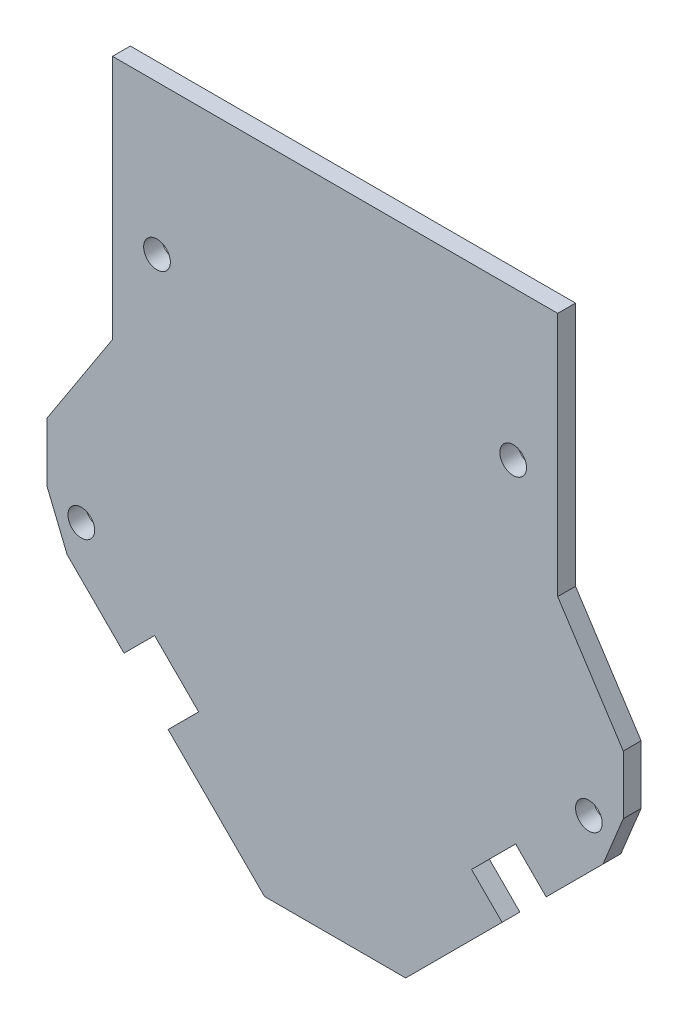
ISO-10303-21;
HEADER;
FILE_DESCRIPTION(('STEP AP214'),'2;1');
FILE_NAME('part.step','',(''),(''),'','','');
FILE_SCHEMA(('AUTOMOTIVE_DESIGN { 1 0 10303 214 1 1 1 1 }'));
ENDSEC;
DATA;
#1=APPLICATION_CONTEXT('core data for automotive mechanical design processes');
#2=APPLICATION_PROTOCOL_DEFINITION('international standard','automotive_design',2000,#1);
#3=PRODUCT_CONTEXT('',#1,'mechanical');
#4=PRODUCT('Part','Part','',(#3));
#5=PRODUCT_RELATED_PRODUCT_CATEGORY('part','',(#4));
#6=PRODUCT_DEFINITION_FORMATION('','',#4);
#7=PRODUCT_DEFINITION_CONTEXT('part definition',#1,'design');
#8=PRODUCT_DEFINITION('design','',#6,#7);
#9=PRODUCT_DEFINITION_SHAPE('','',#8);
#10=(LENGTH_UNIT() NAMED_UNIT(*) SI_UNIT(.MILLI.,.METRE.));
#11=(NAMED_UNIT(*) PLANE_ANGLE_UNIT() SI_UNIT($,.RADIAN.));
#12=(NAMED_UNIT(*) SI_UNIT($,.STERADIAN.) SOLID_ANGLE_UNIT());
#13=UNCERTAINTY_MEASURE_WITH_UNIT(LENGTH_MEASURE(1.E-05),#10,'distance_accuracy_value','');
#14=(GEOMETRIC_REPRESENTATION_CONTEXT(3) GLOBAL_UNCERTAINTY_ASSIGNED_CONTEXT((#13)) GLOBAL_UNIT_ASSIGNED_CONTEXT((#10,
#11,#12)) REPRESENTATION_CONTEXT('',''));
#15=CARTESIAN_POINT('',(0.,0.,0.));
#16=DIRECTION('',(0.,0.,1.));
#17=DIRECTION('',(1.,0.,0.));
#18=AXIS2_PLACEMENT_3D('',#15,#16,#17);
#19=CARTESIAN_POINT('',(15.,26.3525492114366,-37.569097949596));
#20=DIRECTION('',(-0.838670567945423,-0.544639035015028,0.));
#21=DIRECTION('',(0.544639035015028,-0.838670567945423,0.));
#22=AXIS2_PLACEMENT_3D('',#19,#20,#21);
#23=PLANE('',#22);
#24=DIRECTION('',(0.,0.,1.));
#25=VECTOR('',#24,1.);
#26=CARTESIAN_POINT('',(25.,10.9538995732908,-29.3050788894749));
#27=LINE('',#26,#25);
#28=CARTESIAN_POINT('',(25.,10.9538995732908,0.));
#29=VERTEX_POINT('',#28);
#30=CARTESIAN_POINT('',(25.,10.9538995732908,2.));
#31=VERTEX_POINT('',#30);
#32=EDGE_CURVE('E49',#29,#31,#27,.T.);
#33=ORIENTED_EDGE('',*,*,#32,.T.);
#34=DIRECTION('',(0.544639035015028,-0.838670567945423,0.));
#35=VECTOR('',#34,1.);
#36=CARTESIAN_POINT('',(15.,26.3525492114366,2.));
#37=LINE('',#36,#35);
#38=CARTESIAN_POINT('',(32.3636788836174,-0.385171544372863,2.));
#39=VERTEX_POINT('',#38);
#40=EDGE_CURVE('E382',#31,#39,#37,.T.);
#41=ORIENTED_EDGE('',*,*,#40,.T.);
#42=DIRECTION('',(0.,0.,1.));
#43=VECTOR('',#42,1.);
#44=CARTESIAN_POINT('',(32.3636788836174,-0.385171544372863,-37.569097949596));
#45=LINE('',#44,#43);
#46=CARTESIAN_POINT('',(32.3636788836174,-0.385171544372863,0.));
#47=VERTEX_POINT('',#46);
#48=EDGE_CURVE('E379',#47,#39,#45,.T.);
#49=ORIENTED_EDGE('',*,*,#48,.F.);
#50=DIRECTION('',(-0.544639035015028,0.838670567945423,0.));
#51=VECTOR('',#50,1.);
#52=CARTESIAN_POINT('',(15.,26.3525492114366,0.));
#53=LINE('',#52,#51);
#54=EDGE_CURVE('E54',#47,#29,#53,.T.);
#55=ORIENTED_EDGE('',*,*,#54,.T.);
#56=EDGE_LOOP('',(#33,#41,#49,#55));
#57=FACE_BOUND('',#56,.T.);
#58=ADVANCED_FACE('F34',(#57),#23,.F.);
#59=CARTESIAN_POINT('',(25.2216527803458,-10.5209879067736,-15.3523218703808));
#60=DIRECTION('',(-0.707106781186546,0.707106781186549,0.));
#61=DIRECTION('',(-0.707106781186549,-0.707106781186546,0.));
#62=AXIS2_PLACEMENT_3D('',#59,#60,#61);
#63=PLANE('',#62);
#64=DIRECTION('',(0.,0.,1.));
#65=VECTOR('',#64,1.);
#66=CARTESIAN_POINT('',(15.3221578437341,-20.4204828433852,-17.8983872764873));
#67=LINE('',#66,#65);
#68=CARTESIAN_POINT('',(15.3221578437341,-20.4204828433852,0.));
#69=VERTEX_POINT('',#68);
#70=CARTESIAN_POINT('',(15.3221578437341,-20.4204828433852,2.));
#71=VERTEX_POINT('',#70);
#72=EDGE_CURVE('E343',#69,#71,#67,.T.);
#73=ORIENTED_EDGE('',*,*,#72,.F.);
#74=DIRECTION('',(0.707106781186549,0.707106781186546,0.));
#75=VECTOR('',#74,1.);
#76=CARTESIAN_POINT('',(25.2216527803458,-10.5209879067736,0.));
#77=LINE('',#76,#75);
#78=CARTESIAN_POINT('',(20.2719053120399,-15.4707353750794,0.));
#79=VERTEX_POINT('',#78);
#80=EDGE_CURVE('E372',#69,#79,#77,.T.);
#81=ORIENTED_EDGE('',*,*,#80,.T.);
#82=DIRECTION('',(0.,0.,1.));
#83=VECTOR('',#82,1.);
#84=CARTESIAN_POINT('',(20.2719053120399,-15.4707353750794,-12.9075089815671));
#85=LINE('',#84,#83);
#86=CARTESIAN_POINT('',(20.2719053120399,-15.4707353750794,2.));
#87=VERTEX_POINT('',#86);
#88=EDGE_CURVE('E366',#79,#87,#85,.T.);
#89=ORIENTED_EDGE('',*,*,#88,.T.);
#90=DIRECTION('',(-0.707106781186549,-0.707106781186546,0.));
#91=VECTOR('',#90,1.);
#92=CARTESIAN_POINT('',(25.2216527803458,-10.5209879067736,2.));
#93=LINE('',#92,#91);
#94=EDGE_CURVE('E359',#87,#71,#93,.T.);
#95=ORIENTED_EDGE('',*,*,#94,.T.);
#96=EDGE_LOOP('',(#73,#81,#89,#95));
#97=FACE_BOUND('',#96,.T.);
#98=ADVANCED_FACE('F405',(#97),#63,.F.);
#99=CARTESIAN_POINT('',(-26.8116515749497,-4.68834842505034,2.));
#100=DIRECTION('',(0.,0.,1.));
#101=DIRECTION('',(1.,0.,0.));
#102=AXIS2_PLACEMENT_3D('',#99,#100,#101);
#103=PLANE('',#102);
#104=CARTESIAN_POINT('',(20.,21.73,2.));
#105=DIRECTION('',(0.,0.,1.));
#106=DIRECTION('',(1.,0.,0.));
#107=AXIS2_PLACEMENT_3D('',#104,#105,#106);
#108=CIRCLE('',#107,1.5);
#109=CARTESIAN_POINT('',(21.5,21.73,2.));
#110=VERTEX_POINT('',#109);
#111=EDGE_CURVE('E479',#110,#110,#108,.T.);
#112=ORIENTED_EDGE('',*,*,#111,.F.);
#113=EDGE_LOOP('',(#112));
#114=FACE_BOUND('',#113,.T.);
#115=CARTESIAN_POINT('',(-20.,21.73,2.));
#116=DIRECTION('',(0.,0.,1.));
#117=DIRECTION('',(1.,0.,0.));
#118=AXIS2_PLACEMENT_3D('',#115,#116,#117);
#119=CIRCLE('',#118,1.5);
#120=CARTESIAN_POINT('',(-18.5,21.73,2.));
#121=VERTEX_POINT('',#120);
#122=EDGE_CURVE('E472',#121,#121,#119,.T.);
#123=ORIENTED_EDGE('',*,*,#122,.F.);
#124=EDGE_LOOP('',(#123));
#125=FACE_BOUND('',#124,.T.);
#126=DIRECTION('',(1.,0.,0.));
#127=VECTOR('',#126,1.);
#128=CARTESIAN_POINT('',(25.1343436189669,-34.6751224292009,2.));
#129=LINE('',#128,#127);
#130=CARTESIAN_POINT('',(-7.92893218813452,-34.6751224292009,2.));
#131=VERTEX_POINT('',#130);
#132=CARTESIAN_POINT('',(7.92893218813452,-34.6751224292009,2.));
#133=VERTEX_POINT('',#132);
#134=EDGE_CURVE('E168',#131,#133,#129,.T.);
#135=ORIENTED_EDGE('',*,*,#134,.T.);
#136=DIRECTION('',(-0.707106781186547,-0.707106781186548,0.));
#137=VECTOR('',#136,1.);
#138=CARTESIAN_POINT('',(18.7528648088422,-23.8511898084933,2.));
#139=LINE('',#138,#137);
#140=CARTESIAN_POINT('',(18.7528648088422,-23.8511898084933,2.));
#141=VERTEX_POINT('',#140);
#142=EDGE_CURVE('E334',#141,#133,#139,.T.);
#143=ORIENTED_EDGE('',*,*,#142,.F.);
#144=DIRECTION('',(0.707106781186547,-0.707106781186547,0.));
#145=VECTOR('',#144,1.);
#146=CARTESIAN_POINT('',(15.3221578437341,-20.4204828433852,2.));
#147=LINE('',#146,#145);
#148=EDGE_CURVE('E348',#71,#141,#147,.T.);
#149=ORIENTED_EDGE('',*,*,#148,.F.);
#150=ORIENTED_EDGE('',*,*,#94,.F.);
#151=DIRECTION('',(-0.707106781186547,0.707106781186548,0.));
#152=VECTOR('',#151,1.);
#153=CARTESIAN_POINT('',(23.702612277148,-18.9014423401875,2.));
#154=LINE('',#153,#152);
#155=CARTESIAN_POINT('',(23.702612277148,-18.9014423401875,2.));
#156=VERTEX_POINT('',#155);
#157=EDGE_CURVE('E346',#156,#87,#154,.T.);
#158=ORIENTED_EDGE('',*,*,#157,.F.);
#159=DIRECTION('',(-0.707106781186547,-0.707106781186547,0.));
#160=VECTOR('',#159,1.);
#161=CARTESIAN_POINT('',(30.0888178408704,-12.5152367764651,2.));
#162=LINE('',#161,#160);
#163=CARTESIAN_POINT('',(30.0888178408704,-12.5152367764651,2.));
#164=VERTEX_POINT('',#163);
#165=EDGE_CURVE('E363',#164,#156,#162,.T.);
#166=ORIENTED_EDGE('',*,*,#165,.F.);
#167=DIRECTION('',(-0.379143507124506,-0.925337884777949,0.));
#168=VECTOR('',#167,1.);
#169=CARTESIAN_POINT('',(32.3636788836174,-6.96320946779738,2.));
#170=LINE('',#169,#168);
#171=CARTESIAN_POINT('',(32.3636788836174,-6.96320946779738,2.));
#172=VERTEX_POINT('',#171);
#173=EDGE_CURVE('E240',#172,#164,#170,.T.);
#174=ORIENTED_EDGE('',*,*,#173,.F.);
#175=DIRECTION('',(0.,-1.,0.));
#176=VECTOR('',#175,1.);
#177=CARTESIAN_POINT('',(32.3636788836174,-0.385171544372863,2.));
#178=LINE('',#177,#176);
#179=EDGE_CURVE('E374',#39,#172,#178,.T.);
#180=ORIENTED_EDGE('',*,*,#179,.F.);
#181=ORIENTED_EDGE('',*,*,#40,.F.);
#182=DIRECTION('',(0.,-1.,0.));
#183=VECTOR('',#182,1.);
#184=CARTESIAN_POINT('',(25.,10.9538995732908,2.));
#185=LINE('',#184,#183);
#186=CARTESIAN_POINT('',(25.,38.5,2.));
#187=VERTEX_POINT('',#186);
#188=EDGE_CURVE('E179',#187,#31,#185,.T.);
#189=ORIENTED_EDGE('',*,*,#188,.F.);
#190=DIRECTION('',(-1.,0.,0.));
#191=VECTOR('',#190,1.);
#192=CARTESIAN_POINT('',(-15.,38.5,2.));
#193=LINE('',#192,#191);
#194=CARTESIAN_POINT('',(-25.,38.5,2.));
#195=VERTEX_POINT('',#194);
#196=EDGE_CURVE('E11',#187,#195,#193,.T.);
#197=ORIENTED_EDGE('',*,*,#196,.T.);
#198=DIRECTION('',(0.,-1.,0.));
#199=VECTOR('',#198,1.);
#200=CARTESIAN_POINT('',(-25.,10.9538995732908,2.));
#201=LINE('',#200,#199);
#202=CARTESIAN_POINT('',(-25.,10.9538995732908,2.));
#203=VERTEX_POINT('',#202);
#204=EDGE_CURVE('E295',#195,#203,#201,.T.);
#205=ORIENTED_EDGE('',*,*,#204,.T.);
#206=DIRECTION('',(-0.544639035015028,-0.838670567945423,0.));
#207=VECTOR('',#206,1.);
#208=CARTESIAN_POINT('',(-15.,26.3525492114366,2.));
#209=LINE('',#208,#207);
#210=CARTESIAN_POINT('',(-32.3636788836174,-0.385171544372863,2.));
#211=VERTEX_POINT('',#210);
#212=EDGE_CURVE('E225',#203,#211,#209,.T.);
#213=ORIENTED_EDGE('',*,*,#212,.T.);
#214=DIRECTION('',(0.,-1.,0.));
#215=VECTOR('',#214,1.);
#216=CARTESIAN_POINT('',(-32.3636788836174,-0.385171544372863,2.));
#217=LINE('',#216,#215);
#218=CARTESIAN_POINT('',(-32.3636788836174,-6.96320946779738,2.));
#219=VERTEX_POINT('',#218);
#220=EDGE_CURVE('E235',#211,#219,#217,.T.);
#221=ORIENTED_EDGE('',*,*,#220,.T.);
#222=DIRECTION('',(0.379143507124506,-0.925337884777949,0.));
#223=VECTOR('',#222,1.);
#224=CARTESIAN_POINT('',(-32.3636788836174,-6.96320946779738,2.));
#225=LINE('',#224,#223);
#226=CARTESIAN_POINT('',(-30.0888178408704,-12.5152367764651,2.));
#227=VERTEX_POINT('',#226);
#228=EDGE_CURVE('E263',#219,#227,#225,.T.);
#229=ORIENTED_EDGE('',*,*,#228,.T.);
#230=DIRECTION('',(0.707106781186547,-0.707106781186547,0.));
#231=VECTOR('',#230,1.);
#232=CARTESIAN_POINT('',(-30.0888178408704,-12.5152367764651,2.));
#233=LINE('',#232,#231);
#234=CARTESIAN_POINT('',(-23.702612277148,-18.9014423401875,2.));
#235=VERTEX_POINT('',#234);
#236=EDGE_CURVE('E208',#227,#235,#233,.T.);
#237=ORIENTED_EDGE('',*,*,#236,.T.);
#238=DIRECTION('',(0.707106781186547,0.707106781186548,0.));
#239=VECTOR('',#238,1.);
#240=CARTESIAN_POINT('',(-23.702612277148,-18.9014423401875,2.));
#241=LINE('',#240,#239);
#242=CARTESIAN_POINT('',(-20.2719053120399,-15.4707353750794,2.));
#243=VERTEX_POINT('',#242);
#244=EDGE_CURVE('E217',#235,#243,#241,.T.);
#245=ORIENTED_EDGE('',*,*,#244,.T.);
#246=DIRECTION('',(0.707106781186549,-0.707106781186546,0.));
#247=VECTOR('',#246,1.);
#248=CARTESIAN_POINT('',(-25.2216527803458,-10.5209879067736,2.));
#249=LINE('',#248,#247);
#250=CARTESIAN_POINT('',(-15.3221578437341,-20.4204828433852,2.));
#251=VERTEX_POINT('',#250);
#252=EDGE_CURVE('E214',#243,#251,#249,.T.);
#253=ORIENTED_EDGE('',*,*,#252,.T.);
#254=DIRECTION('',(-0.707106781186547,-0.707106781186547,0.));
#255=VECTOR('',#254,1.);
#256=CARTESIAN_POINT('',(-15.3221578437341,-20.4204828433852,2.));
#257=LINE('',#256,#255);
#258=CARTESIAN_POINT('',(-18.7528648088422,-23.8511898084933,2.));
#259=VERTEX_POINT('',#258);
#260=EDGE_CURVE('E195',#251,#259,#257,.T.);
#261=ORIENTED_EDGE('',*,*,#260,.T.);
#262=DIRECTION('',(0.707106781186547,-0.707106781186548,0.));
#263=VECTOR('',#262,1.);
#264=CARTESIAN_POINT('',(-18.7528648088422,-23.8511898084933,2.));
#265=LINE('',#264,#263);
#266=EDGE_CURVE('E187',#259,#131,#265,.T.);
#267=ORIENTED_EDGE('',*,*,#266,.T.);
#268=EDGE_LOOP('',(#135,#143,#149,#150,#158,#166,#174,#180,#181,#189,#197,#205,#213,#221,#229,
#237,#245,#253,#261,#267));
#269=FACE_BOUND('',#268,.T.);
#270=CARTESIAN_POINT('',(28.5,-8.6,2.));
#271=DIRECTION('',(0.,0.,-1.));
#272=DIRECTION('',(-1.,0.,0.));
#273=AXIS2_PLACEMENT_3D('',#270,#271,#272);
#274=CIRCLE('',#273,1.5);
#275=CARTESIAN_POINT('',(27.,-8.6,2.));
#276=VERTEX_POINT('',#275);
#277=EDGE_CURVE('E233',#276,#276,#274,.T.);
#278=ORIENTED_EDGE('',*,*,#277,.T.);
#279=EDGE_LOOP('',(#278));
#280=FACE_BOUND('',#279,.T.);
#281=CARTESIAN_POINT('',(-28.5,-8.6,2.));
#282=DIRECTION('',(0.,0.,1.));
#283=DIRECTION('',(1.,0.,0.));
#284=AXIS2_PLACEMENT_3D('',#281,#282,#283);
#285=CIRCLE('',#284,1.5);
#286=CARTESIAN_POINT('',(-27.,-8.6,2.));
#287=VERTEX_POINT('',#286);
#288=EDGE_CURVE('E256',#287,#287,#285,.T.);
#289=ORIENTED_EDGE('',*,*,#288,.F.);
#290=EDGE_LOOP('',(#289));
#291=FACE_BOUND('',#290,.T.);
#292=ADVANCED_FACE('F192',(#114,#125,#269,#280,#291),#103,.T.);
#293=CARTESIAN_POINT('',(-26.8116515749497,-4.68834842505034,0.));
#294=DIRECTION('',(0.,0.,1.));
#295=DIRECTION('',(1.,0.,0.));
#296=AXIS2_PLACEMENT_3D('',#293,#294,#295);
#297=PLANE('',#296);
#298=CARTESIAN_POINT('',(20.,21.73,0.));
#299=DIRECTION('',(0.,0.,1.));
#300=DIRECTION('',(1.,0.,0.));
#301=AXIS2_PLACEMENT_3D('',#298,#299,#300);
#302=CIRCLE('',#301,1.5);
#303=CARTESIAN_POINT('',(21.5,21.73,0.));
#304=VERTEX_POINT('',#303);
#305=EDGE_CURVE('E467',#304,#304,#302,.F.);
#306=ORIENTED_EDGE('',*,*,#305,.F.);
#307=EDGE_LOOP('',(#306));
#308=FACE_BOUND('',#307,.T.);
#309=CARTESIAN_POINT('',(-20.,21.73,0.));
#310=DIRECTION('',(0.,0.,1.));
#311=DIRECTION('',(1.,0.,0.));
#312=AXIS2_PLACEMENT_3D('',#309,#310,#311);
#313=CIRCLE('',#312,1.5);
#314=CARTESIAN_POINT('',(-18.5,21.73,0.));
#315=VERTEX_POINT('',#314);
#316=EDGE_CURVE('E470',#315,#315,#313,.F.);
#317=ORIENTED_EDGE('',*,*,#316,.F.);
#318=EDGE_LOOP('',(#317));
#319=FACE_BOUND('',#318,.T.);
#320=DIRECTION('',(0.707106781186547,0.707106781186548,0.));
#321=VECTOR('',#320,1.);
#322=CARTESIAN_POINT('',(18.7528648088422,-23.8511898084933,0.));
#323=LINE('',#322,#321);
#324=CARTESIAN_POINT('',(7.92893218813455,-34.6751224292009,0.));
#325=VERTEX_POINT('',#324);
#326=CARTESIAN_POINT('',(18.7528648088422,-23.8511898084933,0.));
#327=VERTEX_POINT('',#326);
#328=EDGE_CURVE('E339',#325,#327,#323,.T.);
#329=ORIENTED_EDGE('',*,*,#328,.F.);
#330=DIRECTION('',(1.,0.,0.));
#331=VECTOR('',#330,1.);
#332=CARTESIAN_POINT('',(25.1343436189669,-34.6751224292009,0.));
#333=LINE('',#332,#331);
#334=CARTESIAN_POINT('',(-7.92893218813452,-34.6751224292009,0.));
#335=VERTEX_POINT('',#334);
#336=EDGE_CURVE('E180',#335,#325,#333,.T.);
#337=ORIENTED_EDGE('',*,*,#336,.F.);
#338=DIRECTION('',(-0.707106781186547,0.707106781186548,0.));
#339=VECTOR('',#338,1.);
#340=CARTESIAN_POINT('',(-18.7528648088422,-23.8511898084933,0.));
#341=LINE('',#340,#339);
#342=CARTESIAN_POINT('',(-18.7528648088422,-23.8511898084933,0.));
#343=VERTEX_POINT('',#342);
#344=EDGE_CURVE('E189',#335,#343,#341,.T.);
#345=ORIENTED_EDGE('',*,*,#344,.T.);
#346=DIRECTION('',(0.707106781186548,0.707106781186548,0.));
#347=VECTOR('',#346,1.);
#348=CARTESIAN_POINT('',(-15.3221578437341,-20.4204828433852,0.));
#349=LINE('',#348,#347);
#350=CARTESIAN_POINT('',(-15.3221578437341,-20.4204828433852,0.));
#351=VERTEX_POINT('',#350);
#352=EDGE_CURVE('E205',#343,#351,#349,.T.);
#353=ORIENTED_EDGE('',*,*,#352,.T.);
#354=DIRECTION('',(-0.707106781186549,0.707106781186546,0.));
#355=VECTOR('',#354,1.);
#356=CARTESIAN_POINT('',(-25.2216527803458,-10.5209879067736,0.));
#357=LINE('',#356,#355);
#358=CARTESIAN_POINT('',(-20.2719053120399,-15.4707353750794,0.));
#359=VERTEX_POINT('',#358);
#360=EDGE_CURVE('E223',#351,#359,#357,.T.);
#361=ORIENTED_EDGE('',*,*,#360,.T.);
#362=DIRECTION('',(-0.707106781186547,-0.707106781186548,0.));
#363=VECTOR('',#362,1.);
#364=CARTESIAN_POINT('',(-23.702612277148,-18.9014423401875,0.));
#365=LINE('',#364,#363);
#366=CARTESIAN_POINT('',(-23.702612277148,-18.9014423401875,0.));
#367=VERTEX_POINT('',#366);
#368=EDGE_CURVE('E211',#359,#367,#365,.T.);
#369=ORIENTED_EDGE('',*,*,#368,.T.);
#370=DIRECTION('',(-0.707106781186548,0.707106781186548,0.));
#371=VECTOR('',#370,1.);
#372=CARTESIAN_POINT('',(-30.0888178408704,-12.5152367764651,0.));
#373=LINE('',#372,#371);
#374=CARTESIAN_POINT('',(-30.0888178408704,-12.5152367764651,0.));
#375=VERTEX_POINT('',#374);
#376=EDGE_CURVE('E209',#367,#375,#373,.T.);
#377=ORIENTED_EDGE('',*,*,#376,.T.);
#378=DIRECTION('',(-0.379143507124506,0.925337884777949,0.));
#379=VECTOR('',#378,1.);
#380=CARTESIAN_POINT('',(-32.3636788836174,-6.96320946779738,0.));
#381=LINE('',#380,#379);
#382=CARTESIAN_POINT('',(-32.3636788836174,-6.96320946779738,0.));
#383=VERTEX_POINT('',#382);
#384=EDGE_CURVE('E257',#375,#383,#381,.T.);
#385=ORIENTED_EDGE('',*,*,#384,.T.);
#386=DIRECTION('',(0.,1.,0.));
#387=VECTOR('',#386,1.);
#388=CARTESIAN_POINT('',(-32.3636788836174,-0.385171544372863,0.));
#389=LINE('',#388,#387);
#390=CARTESIAN_POINT('',(-32.3636788836174,-0.385171544372859,0.));
#391=VERTEX_POINT('',#390);
#392=EDGE_CURVE('E230',#383,#391,#389,.T.);
#393=ORIENTED_EDGE('',*,*,#392,.T.);
#394=DIRECTION('',(0.544639035015028,0.838670567945423,0.));
#395=VECTOR('',#394,1.);
#396=CARTESIAN_POINT('',(-15.,26.3525492114366,0.));
#397=LINE('',#396,#395);
#398=CARTESIAN_POINT('',(-25.,10.9538995732908,0.));
#399=VERTEX_POINT('',#398);
#400=EDGE_CURVE('E227',#391,#399,#397,.T.);
#401=ORIENTED_EDGE('',*,*,#400,.T.);
#402=DIRECTION('',(0.,1.,0.));
#403=VECTOR('',#402,1.);
#404=CARTESIAN_POINT('',(-25.,10.9538995732908,0.));
#405=LINE('',#404,#403);
#406=CARTESIAN_POINT('',(-25.,38.5,0.));
#407=VERTEX_POINT('',#406);
#408=EDGE_CURVE('E200',#399,#407,#405,.T.);
#409=ORIENTED_EDGE('',*,*,#408,.T.);
#410=DIRECTION('',(-1.,0.,0.));
#411=VECTOR('',#410,1.);
#412=CARTESIAN_POINT('',(-15.,38.5,0.));
#413=LINE('',#412,#411);
#414=CARTESIAN_POINT('',(25.,38.5,0.));
#415=VERTEX_POINT('',#414);
#416=EDGE_CURVE('E38',#415,#407,#413,.T.);
#417=ORIENTED_EDGE('',*,*,#416,.F.);
#418=DIRECTION('',(0.,1.,0.));
#419=VECTOR('',#418,1.);
#420=CARTESIAN_POINT('',(25.,10.9538995732908,0.));
#421=LINE('',#420,#419);
#422=EDGE_CURVE('E332',#29,#415,#421,.T.);
#423=ORIENTED_EDGE('',*,*,#422,.F.);
#424=ORIENTED_EDGE('',*,*,#54,.F.);
#425=DIRECTION('',(0.,1.,0.));
#426=VECTOR('',#425,1.);
#427=CARTESIAN_POINT('',(32.3636788836174,-0.385171544372863,0.));
#428=LINE('',#427,#426);
#429=CARTESIAN_POINT('',(32.3636788836174,-6.96320946779738,0.));
#430=VERTEX_POINT('',#429);
#431=EDGE_CURVE('E376',#430,#47,#428,.T.);
#432=ORIENTED_EDGE('',*,*,#431,.F.);
#433=DIRECTION('',(0.379143507124506,0.925337884777949,0.));
#434=VECTOR('',#433,1.);
#435=CARTESIAN_POINT('',(32.3636788836174,-6.96320946779738,0.));
#436=LINE('',#435,#434);
#437=CARTESIAN_POINT('',(30.0888178408704,-12.5152367764651,0.));
#438=VERTEX_POINT('',#437);
#439=EDGE_CURVE('E246',#438,#430,#436,.T.);
#440=ORIENTED_EDGE('',*,*,#439,.F.);
#441=DIRECTION('',(0.707106781186548,0.707106781186548,0.));
#442=VECTOR('',#441,1.);
#443=CARTESIAN_POINT('',(30.0888178408704,-12.5152367764651,0.));
#444=LINE('',#443,#442);
#445=CARTESIAN_POINT('',(23.702612277148,-18.9014423401875,0.));
#446=VERTEX_POINT('',#445);
#447=EDGE_CURVE('E356',#446,#438,#444,.T.);
#448=ORIENTED_EDGE('',*,*,#447,.F.);
#449=DIRECTION('',(0.707106781186547,-0.707106781186548,0.));
#450=VECTOR('',#449,1.);
#451=CARTESIAN_POINT('',(23.702612277148,-18.9014423401875,0.));
#452=LINE('',#451,#450);
#453=EDGE_CURVE('E360',#79,#446,#452,.T.);
#454=ORIENTED_EDGE('',*,*,#453,.F.);
#455=ORIENTED_EDGE('',*,*,#80,.F.);
#456=DIRECTION('',(-0.707106781186548,0.707106781186548,0.));
#457=VECTOR('',#456,1.);
#458=CARTESIAN_POINT('',(15.3221578437341,-20.4204828433852,0.));
#459=LINE('',#458,#457);
#460=EDGE_CURVE('E342',#327,#69,#459,.T.);
#461=ORIENTED_EDGE('',*,*,#460,.F.);
#462=EDGE_LOOP('',(#329,#337,#345,#353,#361,#369,#377,#385,#393,#401,#409,#417,#423,#424,#432,
#440,#448,#454,#455,#461));
#463=FACE_BOUND('',#462,.T.);
#464=CARTESIAN_POINT('',(28.5,-8.6,0.));
#465=DIRECTION('',(0.,0.,1.));
#466=DIRECTION('',(1.,0.,0.));
#467=AXIS2_PLACEMENT_3D('',#464,#465,#466);
#468=CIRCLE('',#467,1.5);
#469=CARTESIAN_POINT('',(30.,-8.6,0.));
#470=VERTEX_POINT('',#469);
#471=EDGE_CURVE('E251',#470,#470,#468,.T.);
#472=ORIENTED_EDGE('',*,*,#471,.T.);
#473=EDGE_LOOP('',(#472));
#474=FACE_BOUND('',#473,.T.);
#475=CARTESIAN_POINT('',(-28.5,-8.6,0.));
#476=DIRECTION('',(0.,0.,1.));
#477=DIRECTION('',(1.,0.,0.));
#478=AXIS2_PLACEMENT_3D('',#475,#476,#477);
#479=CIRCLE('',#478,1.5);
#480=CARTESIAN_POINT('',(-27.,-8.6,0.));
#481=VERTEX_POINT('',#480);
#482=EDGE_CURVE('E259',#481,#481,#479,.F.);
#483=ORIENTED_EDGE('',*,*,#482,.F.);
#484=EDGE_LOOP('',(#483));
#485=FACE_BOUND('',#484,.T.);
#486=ADVANCED_FACE('F286',(#308,#319,#463,#474,#485),#297,.F.);
#487=CARTESIAN_POINT('',(-15.,38.5,2.));
#488=DIRECTION('',(0.,-1.,0.));
#489=DIRECTION('',(0.,0.,-1.));
#490=AXIS2_PLACEMENT_3D('',#487,#488,#489);
#491=PLANE('',#490);
#492=ORIENTED_EDGE('',*,*,#416,.T.);
#493=DIRECTION('',(0.,0.,1.));
#494=VECTOR('',#493,1.);
#495=CARTESIAN_POINT('',(-25.,38.5,-29.3050788894749));
#496=LINE('',#495,#494);
#497=EDGE_CURVE('E279',#407,#195,#496,.T.);
#498=ORIENTED_EDGE('',*,*,#497,.T.);
#499=ORIENTED_EDGE('',*,*,#196,.F.);
#500=DIRECTION('',(0.,0.,1.));
#501=VECTOR('',#500,1.);
#502=CARTESIAN_POINT('',(25.,38.5,-29.3050788894749));
#503=LINE('',#502,#501);
#504=EDGE_CURVE('E282',#415,#187,#503,.T.);
#505=ORIENTED_EDGE('',*,*,#504,.F.);
#506=EDGE_LOOP('',(#492,#498,#499,#505));
#507=FACE_BOUND('',#506,.T.);
#508=ADVANCED_FACE('F36',(#507),#491,.F.);
#509=CARTESIAN_POINT('',(-32.3636788836174,-6.96320946779738,-12.818513052528));
#510=DIRECTION('',(-0.925337884777949,-0.379143507124506,0.));
#511=DIRECTION('',(0.379143507124506,-0.925337884777949,0.));
#512=AXIS2_PLACEMENT_3D('',#509,#510,#511);
#513=PLANE('',#512);
#514=ORIENTED_EDGE('',*,*,#384,.F.);
#515=DIRECTION('',(0.,0.,1.));
#516=VECTOR('',#515,1.);
#517=CARTESIAN_POINT('',(-30.0888178408704,-12.5152367764651,-12.818513052528));
#518=LINE('',#517,#516);
#519=EDGE_CURVE('E260',#375,#227,#518,.T.);
#520=ORIENTED_EDGE('',*,*,#519,.T.);
#521=ORIENTED_EDGE('',*,*,#228,.F.);
#522=DIRECTION('',(0.,0.,1.));
#523=VECTOR('',#522,1.);
#524=CARTESIAN_POINT('',(-32.3636788836174,-6.96320946779738,-12.818513052528));
#525=LINE('',#524,#523);
#526=EDGE_CURVE('E266',#383,#219,#525,.T.);
#527=ORIENTED_EDGE('',*,*,#526,.F.);
#528=EDGE_LOOP('',(#514,#520,#521,#527));
#529=FACE_BOUND('',#528,.T.);
#530=ADVANCED_FACE('F319',(#529),#513,.T.);
#531=CARTESIAN_POINT('',(-28.5,-8.6,-12.818513052528));
#532=DIRECTION('',(0.,0.,1.));
#533=DIRECTION('',(1.,0.,0.));
#534=AXIS2_PLACEMENT_3D('',#531,#532,#533);
#535=CYLINDRICAL_SURFACE('',#534,1.5);
#536=ORIENTED_EDGE('',*,*,#482,.T.);
#537=EDGE_LOOP('',(#536));
#538=FACE_BOUND('',#537,.T.);
#539=ORIENTED_EDGE('',*,*,#288,.T.);
#540=EDGE_LOOP('',(#539));
#541=FACE_BOUND('',#540,.T.);
#542=ADVANCED_FACE('F449',(#538,#541),#535,.F.);
#543=CARTESIAN_POINT('',(32.3636788836174,-6.96320946779738,-12.818513052528));
#544=DIRECTION('',(-0.925337884777949,0.379143507124506,0.));
#545=DIRECTION('',(-0.379143507124506,-0.925337884777949,0.));
#546=AXIS2_PLACEMENT_3D('',#543,#544,#545);
#547=PLANE('',#546);
#548=DIRECTION('',(0.,0.,1.));
#549=VECTOR('',#548,1.);
#550=CARTESIAN_POINT('',(30.0888178408704,-12.5152367764651,-12.818513052528));
#551=LINE('',#550,#549);
#552=EDGE_CURVE('E242',#438,#164,#551,.T.);
#553=ORIENTED_EDGE('',*,*,#552,.F.);
#554=ORIENTED_EDGE('',*,*,#439,.T.);
#555=DIRECTION('',(0.,0.,1.));
#556=VECTOR('',#555,1.);
#557=CARTESIAN_POINT('',(32.3636788836174,-6.96320946779738,-12.818513052528));
#558=LINE('',#557,#556);
#559=EDGE_CURVE('E243',#430,#172,#558,.T.);
#560=ORIENTED_EDGE('',*,*,#559,.T.);
#561=ORIENTED_EDGE('',*,*,#173,.T.);
#562=EDGE_LOOP('',(#553,#554,#560,#561));
#563=FACE_BOUND('',#562,.T.);
#564=ADVANCED_FACE('F394',(#563),#547,.F.);
#565=CARTESIAN_POINT('',(28.5,-8.6,-12.818513052528));
#566=DIRECTION('',(0.,0.,1.));
#567=DIRECTION('',(1.,0.,0.));
#568=AXIS2_PLACEMENT_3D('',#565,#566,#567);
#569=CYLINDRICAL_SURFACE('',#568,1.5);
#570=ORIENTED_EDGE('',*,*,#471,.F.);
#571=EDGE_LOOP('',(#570));
#572=FACE_BOUND('',#571,.T.);
#573=ORIENTED_EDGE('',*,*,#277,.F.);
#574=EDGE_LOOP('',(#573));
#575=FACE_BOUND('',#574,.T.);
#576=ADVANCED_FACE('F444',(#572,#575),#569,.F.);
#577=CARTESIAN_POINT('',(-32.3636788836174,-0.385171544372863,-37.569097949596));
#578=DIRECTION('',(-1.,0.,0.));
#579=DIRECTION('',(0.,0.,1.));
#580=AXIS2_PLACEMENT_3D('',#577,#578,#579);
#581=PLANE('',#580);
#582=ORIENTED_EDGE('',*,*,#392,.F.);
#583=ORIENTED_EDGE('',*,*,#526,.T.);
#584=ORIENTED_EDGE('',*,*,#220,.F.);
#585=DIRECTION('',(0.,0.,1.));
#586=VECTOR('',#585,1.);
#587=CARTESIAN_POINT('',(-32.3636788836174,-0.385171544372863,-37.569097949596));
#588=LINE('',#587,#586);
#589=EDGE_CURVE('E231',#391,#211,#588,.T.);
#590=ORIENTED_EDGE('',*,*,#589,.F.);
#591=EDGE_LOOP('',(#582,#583,#584,#590));
#592=FACE_BOUND('',#591,.T.);
#593=ADVANCED_FACE('F327',(#592),#581,.T.);
#594=CARTESIAN_POINT('',(-15.,26.3525492114366,-37.569097949596));
#595=DIRECTION('',(-0.838670567945423,0.544639035015028,0.));
#596=DIRECTION('',(-0.544639035015028,-0.838670567945423,0.));
#597=AXIS2_PLACEMENT_3D('',#594,#595,#596);
#598=PLANE('',#597);
#599=DIRECTION('',(0.,0.,1.));
#600=VECTOR('',#599,1.);
#601=CARTESIAN_POINT('',(-25.,10.9538995732908,-29.3050788894749));
#602=LINE('',#601,#600);
#603=EDGE_CURVE('E291',#399,#203,#602,.T.);
#604=ORIENTED_EDGE('',*,*,#603,.F.);
#605=ORIENTED_EDGE('',*,*,#400,.F.);
#606=ORIENTED_EDGE('',*,*,#589,.T.);
#607=ORIENTED_EDGE('',*,*,#212,.F.);
#608=EDGE_LOOP('',(#604,#605,#606,#607));
#609=FACE_BOUND('',#608,.T.);
#610=ADVANCED_FACE('F324',(#609),#598,.T.);
#611=CARTESIAN_POINT('',(-25.2216527803458,-10.5209879067736,-15.3523218703808));
#612=DIRECTION('',(-0.707106781186546,-0.707106781186549,0.));
#613=DIRECTION('',(0.707106781186549,-0.707106781186546,0.));
#614=AXIS2_PLACEMENT_3D('',#611,#612,#613);
#615=PLANE('',#614);
#616=DIRECTION('',(0.,0.,1.));
#617=VECTOR('',#616,1.);
#618=CARTESIAN_POINT('',(-15.3221578437341,-20.4204828433852,-17.8983872764873));
#619=LINE('',#618,#617);
#620=EDGE_CURVE('E196',#351,#251,#619,.T.);
#621=ORIENTED_EDGE('',*,*,#620,.T.);
#622=ORIENTED_EDGE('',*,*,#252,.F.);
#623=DIRECTION('',(0.,0.,1.));
#624=VECTOR('',#623,1.);
#625=CARTESIAN_POINT('',(-20.2719053120399,-15.4707353750794,-12.9075089815671));
#626=LINE('',#625,#624);
#627=EDGE_CURVE('E212',#359,#243,#626,.T.);
#628=ORIENTED_EDGE('',*,*,#627,.F.);
#629=ORIENTED_EDGE('',*,*,#360,.F.);
#630=EDGE_LOOP('',(#621,#622,#628,#629));
#631=FACE_BOUND('',#630,.T.);
#632=ADVANCED_FACE('F305',(#631),#615,.T.);
#633=CARTESIAN_POINT('',(-23.702612277148,-18.9014423401875,-12.9075089815671));
#634=DIRECTION('',(0.707106781186548,-0.707106781186547,0.));
#635=DIRECTION('',(0.707106781186547,0.707106781186548,0.));
#636=AXIS2_PLACEMENT_3D('',#633,#634,#635);
#637=PLANE('',#636);
#638=ORIENTED_EDGE('',*,*,#368,.F.);
#639=ORIENTED_EDGE('',*,*,#627,.T.);
#640=ORIENTED_EDGE('',*,*,#244,.F.);
#641=DIRECTION('',(0.,0.,1.));
#642=VECTOR('',#641,1.);
#643=CARTESIAN_POINT('',(-23.702612277148,-18.9014423401875,-12.9075089815671));
#644=LINE('',#643,#642);
#645=EDGE_CURVE('E220',#367,#235,#644,.T.);
#646=ORIENTED_EDGE('',*,*,#645,.F.);
#647=EDGE_LOOP('',(#638,#639,#640,#646));
#648=FACE_BOUND('',#647,.T.);
#649=ADVANCED_FACE('F311',(#648),#637,.T.);
#650=CARTESIAN_POINT('',(-30.0888178408704,-12.5152367764651,-12.9075089815671));
#651=DIRECTION('',(-0.707106781186548,-0.707106781186548,0.));
#652=DIRECTION('',(0.707106781186548,-0.707106781186548,0.));
#653=AXIS2_PLACEMENT_3D('',#650,#651,#652);
#654=PLANE('',#653);
#655=ORIENTED_EDGE('',*,*,#376,.F.);
#656=ORIENTED_EDGE('',*,*,#645,.T.);
#657=ORIENTED_EDGE('',*,*,#236,.F.);
#658=ORIENTED_EDGE('',*,*,#519,.F.);
#659=EDGE_LOOP('',(#655,#656,#657,#658));
#660=FACE_BOUND('',#659,.T.);
#661=ADVANCED_FACE('F315',(#660),#654,.T.);
#662=CARTESIAN_POINT('',(-18.7528648088422,-23.8511898084933,-17.8983872764873));
#663=DIRECTION('',(-0.707106781186548,-0.707106781186547,0.));
#664=DIRECTION('',(0.707106781186547,-0.707106781186548,0.));
#665=AXIS2_PLACEMENT_3D('',#662,#663,#664);
#666=PLANE('',#665);
#667=ORIENTED_EDGE('',*,*,#344,.F.);
#668=DIRECTION('',(0.,0.,1.));
#669=VECTOR('',#668,1.);
#670=CARTESIAN_POINT('',(-7.92893218813452,-34.6751224292009,-17.8983872764873));
#671=LINE('',#670,#669);
#672=EDGE_CURVE('E171',#335,#131,#671,.T.);
#673=ORIENTED_EDGE('',*,*,#672,.T.);
#674=ORIENTED_EDGE('',*,*,#266,.F.);
#675=DIRECTION('',(0.,0.,1.));
#676=VECTOR('',#675,1.);
#677=CARTESIAN_POINT('',(-18.7528648088422,-23.8511898084933,-17.8983872764873));
#678=LINE('',#677,#676);
#679=EDGE_CURVE('E190',#343,#259,#678,.T.);
#680=ORIENTED_EDGE('',*,*,#679,.F.);
#681=EDGE_LOOP('',(#667,#673,#674,#680));
#682=FACE_BOUND('',#681,.T.);
#683=ADVANCED_FACE('F185',(#682),#666,.T.);
#684=CARTESIAN_POINT('',(-15.3221578437341,-20.4204828433852,-17.8983872764873));
#685=DIRECTION('',(-0.707106781186548,0.707106781186548,0.));
#686=DIRECTION('',(-0.707106781186548,-0.707106781186548,0.));
#687=AXIS2_PLACEMENT_3D('',#684,#685,#686);
#688=PLANE('',#687);
#689=ORIENTED_EDGE('',*,*,#352,.F.);
#690=ORIENTED_EDGE('',*,*,#679,.T.);
#691=ORIENTED_EDGE('',*,*,#260,.F.);
#692=ORIENTED_EDGE('',*,*,#620,.F.);
#693=EDGE_LOOP('',(#689,#690,#691,#692));
#694=FACE_BOUND('',#693,.T.);
#695=ADVANCED_FACE('F302',(#694),#688,.T.);
#696=CARTESIAN_POINT('',(-25.,10.9538995732908,-29.3050788894749));
#697=DIRECTION('',(-1.,0.,0.));
#698=DIRECTION('',(0.,0.,1.));
#699=AXIS2_PLACEMENT_3D('',#696,#697,#698);
#700=PLANE('',#699);
#701=ORIENTED_EDGE('',*,*,#408,.F.);
#702=ORIENTED_EDGE('',*,*,#603,.T.);
#703=ORIENTED_EDGE('',*,*,#204,.F.);
#704=ORIENTED_EDGE('',*,*,#497,.F.);
#705=EDGE_LOOP('',(#701,#702,#703,#704));
#706=FACE_BOUND('',#705,.T.);
#707=ADVANCED_FACE('F293',(#706),#700,.T.);
#708=CARTESIAN_POINT('',(32.3636788836174,-0.385171544372863,-37.569097949596));
#709=DIRECTION('',(-1.,0.,0.));
#710=DIRECTION('',(0.,0.,1.));
#711=AXIS2_PLACEMENT_3D('',#708,#709,#710);
#712=PLANE('',#711);
#713=ORIENTED_EDGE('',*,*,#559,.F.);
#714=ORIENTED_EDGE('',*,*,#431,.T.);
#715=ORIENTED_EDGE('',*,*,#48,.T.);
#716=ORIENTED_EDGE('',*,*,#179,.T.);
#717=EDGE_LOOP('',(#713,#714,#715,#716));
#718=FACE_BOUND('',#717,.T.);
#719=ADVANCED_FACE('F388',(#718),#712,.F.);
#720=CARTESIAN_POINT('',(23.702612277148,-18.9014423401875,-12.9075089815671));
#721=DIRECTION('',(0.707106781186548,0.707106781186547,0.));
#722=DIRECTION('',(-0.707106781186547,0.707106781186548,0.));
#723=AXIS2_PLACEMENT_3D('',#720,#721,#722);
#724=PLANE('',#723);
#725=ORIENTED_EDGE('',*,*,#88,.F.);
#726=ORIENTED_EDGE('',*,*,#453,.T.);
#727=DIRECTION('',(0.,0.,1.));
#728=VECTOR('',#727,1.);
#729=CARTESIAN_POINT('',(23.702612277148,-18.9014423401875,-12.9075089815671));
#730=LINE('',#729,#728);
#731=EDGE_CURVE('E367',#446,#156,#730,.T.);
#732=ORIENTED_EDGE('',*,*,#731,.T.);
#733=ORIENTED_EDGE('',*,*,#157,.T.);
#734=EDGE_LOOP('',(#725,#726,#732,#733));
#735=FACE_BOUND('',#734,.T.);
#736=ADVANCED_FACE('F402',(#735),#724,.F.);
#737=CARTESIAN_POINT('',(30.0888178408704,-12.5152367764651,-12.9075089815671));
#738=DIRECTION('',(-0.707106781186548,0.707106781186548,0.));
#739=DIRECTION('',(-0.707106781186548,-0.707106781186548,0.));
#740=AXIS2_PLACEMENT_3D('',#737,#738,#739);
#741=PLANE('',#740);
#742=ORIENTED_EDGE('',*,*,#731,.F.);
#743=ORIENTED_EDGE('',*,*,#447,.T.);
#744=ORIENTED_EDGE('',*,*,#552,.T.);
#745=ORIENTED_EDGE('',*,*,#165,.T.);
#746=EDGE_LOOP('',(#742,#743,#744,#745));
#747=FACE_BOUND('',#746,.T.);
#748=ADVANCED_FACE('F397',(#747),#741,.F.);
#749=CARTESIAN_POINT('',(18.7528648088422,-23.8511898084933,-17.8983872764873));
#750=DIRECTION('',(-0.707106781186548,0.707106781186547,0.));
#751=DIRECTION('',(-0.707106781186547,-0.707106781186548,0.));
#752=AXIS2_PLACEMENT_3D('',#749,#750,#751);
#753=PLANE('',#752);
#754=DIRECTION('',(0.,0.,1.));
#755=VECTOR('',#754,1.);
#756=CARTESIAN_POINT('',(7.92893218813452,-34.6751224292009,-17.8983872764873));
#757=LINE('',#756,#755);
#758=EDGE_CURVE('E174',#325,#133,#757,.T.);
#759=ORIENTED_EDGE('',*,*,#758,.F.);
#760=ORIENTED_EDGE('',*,*,#328,.T.);
#761=DIRECTION('',(0.,0.,1.));
#762=VECTOR('',#761,1.);
#763=CARTESIAN_POINT('',(18.7528648088422,-23.8511898084933,-17.8983872764873));
#764=LINE('',#763,#762);
#765=EDGE_CURVE('E353',#327,#141,#764,.T.);
#766=ORIENTED_EDGE('',*,*,#765,.T.);
#767=ORIENTED_EDGE('',*,*,#142,.T.);
#768=EDGE_LOOP('',(#759,#760,#766,#767));
#769=FACE_BOUND('',#768,.T.);
#770=ADVANCED_FACE('F411',(#769),#753,.F.);
#771=CARTESIAN_POINT('',(15.3221578437341,-20.4204828433852,-17.8983872764873));
#772=DIRECTION('',(-0.707106781186548,-0.707106781186548,0.));
#773=DIRECTION('',(0.707106781186548,-0.707106781186548,0.));
#774=AXIS2_PLACEMENT_3D('',#771,#772,#773);
#775=PLANE('',#774);
#776=ORIENTED_EDGE('',*,*,#765,.F.);
#777=ORIENTED_EDGE('',*,*,#460,.T.);
#778=ORIENTED_EDGE('',*,*,#72,.T.);
#779=ORIENTED_EDGE('',*,*,#148,.T.);
#780=EDGE_LOOP('',(#776,#777,#778,#779));
#781=FACE_BOUND('',#780,.T.);
#782=ADVANCED_FACE('F409',(#781),#775,.F.);
#783=CARTESIAN_POINT('',(25.,10.9538995732908,-29.3050788894749));
#784=DIRECTION('',(-1.,0.,0.));
#785=DIRECTION('',(0.,0.,1.));
#786=AXIS2_PLACEMENT_3D('',#783,#784,#785);
#787=PLANE('',#786);
#788=ORIENTED_EDGE('',*,*,#32,.F.);
#789=ORIENTED_EDGE('',*,*,#422,.T.);
#790=ORIENTED_EDGE('',*,*,#504,.T.);
#791=ORIENTED_EDGE('',*,*,#188,.T.);
#792=EDGE_LOOP('',(#788,#789,#790,#791));
#793=FACE_BOUND('',#792,.T.);
#794=ADVANCED_FACE('F331',(#793),#787,.F.);
#795=CARTESIAN_POINT('',(25.1343436189669,-34.6751224292009,59.8541473257921));
#796=DIRECTION('',(0.,1.,0.));
#797=DIRECTION('',(0.,0.,1.));
#798=AXIS2_PLACEMENT_3D('',#795,#796,#797);
#799=PLANE('',#798);
#800=ORIENTED_EDGE('',*,*,#672,.F.);
#801=ORIENTED_EDGE('',*,*,#336,.T.);
#802=ORIENTED_EDGE('',*,*,#758,.T.);
#803=ORIENTED_EDGE('',*,*,#134,.F.);
#804=EDGE_LOOP('',(#800,#801,#802,#803));
#805=FACE_BOUND('',#804,.T.);
#806=ADVANCED_FACE('F170',(#805),#799,.F.);
#807=CARTESIAN_POINT('',(-20.,21.73,-4.24264068711929));
#808=DIRECTION('',(0.,0.,1.));
#809=DIRECTION('',(1.,0.,0.));
#810=AXIS2_PLACEMENT_3D('',#807,#808,#809);
#811=CYLINDRICAL_SURFACE('',#810,1.5);
#812=ORIENTED_EDGE('',*,*,#316,.T.);
#813=EDGE_LOOP('',(#812));
#814=FACE_BOUND('',#813,.T.);
#815=ORIENTED_EDGE('',*,*,#122,.T.);
#816=EDGE_LOOP('',(#815));
#817=FACE_BOUND('',#816,.T.);
#818=ADVANCED_FACE('F487',(#814,#817),#811,.F.);
#819=CARTESIAN_POINT('',(20.,21.73,-4.24264068711929));
#820=DIRECTION('',(0.,0.,1.));
#821=DIRECTION('',(1.,0.,0.));
#822=AXIS2_PLACEMENT_3D('',#819,#820,#821);
#823=CYLINDRICAL_SURFACE('',#822,1.5);
#824=ORIENTED_EDGE('',*,*,#305,.T.);
#825=EDGE_LOOP('',(#824));
#826=FACE_BOUND('',#825,.T.);
#827=ORIENTED_EDGE('',*,*,#111,.T.);
#828=EDGE_LOOP('',(#827));
#829=FACE_BOUND('',#828,.T.);
#830=ADVANCED_FACE('F483',(#826,#829),#823,.F.);
#831=CLOSED_SHELL('',(#58,#98,#292,#486,#508,#530,#542,#564,#576,#593,#610,#632,#649,#661,#683,
#695,#707,#719,#736,#748,#770,#782,#794,#806,#818,#830));
#832=MANIFOLD_SOLID_BREP('B2',#831);
#833=ADVANCED_BREP_SHAPE_REPRESENTATION('',(#18,#832),#14);
#834=SHAPE_DEFINITION_REPRESENTATION(#9,#833);
ENDSEC;
END-ISO-10303-21;
